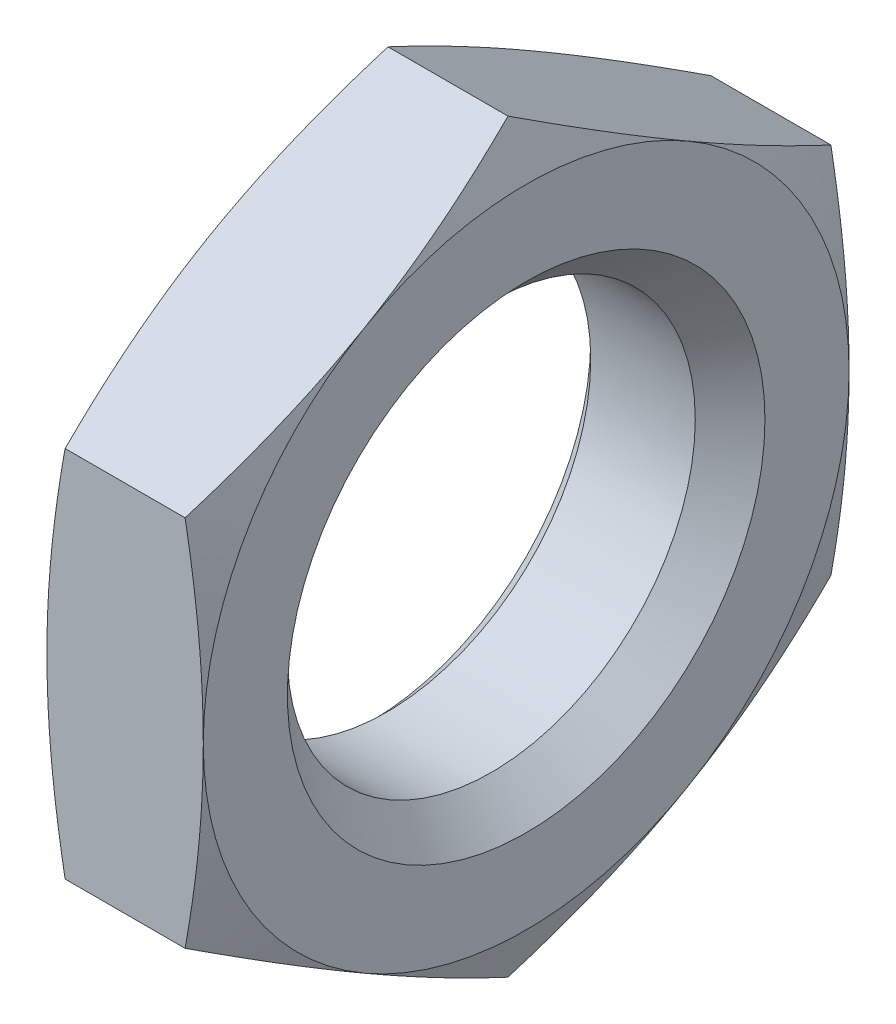
ISO-10303-21;
HEADER;
FILE_DESCRIPTION(('STEP AP214'),'2;1');
FILE_NAME('part.step','',(''),(''),'','','');
FILE_SCHEMA(('AUTOMOTIVE_DESIGN { 1 0 10303 214 1 1 1 1 }'));
ENDSEC;
DATA;
#1=APPLICATION_CONTEXT('core data for automotive mechanical design processes');
#2=APPLICATION_PROTOCOL_DEFINITION('international standard','automotive_design',2000,#1);
#3=PRODUCT_CONTEXT('',#1,'mechanical');
#4=PRODUCT('Part','Part','',(#3));
#5=PRODUCT_RELATED_PRODUCT_CATEGORY('part','',(#4));
#6=PRODUCT_DEFINITION_FORMATION('','',#4);
#7=PRODUCT_DEFINITION_CONTEXT('part definition',#1,'design');
#8=PRODUCT_DEFINITION('design','',#6,#7);
#9=PRODUCT_DEFINITION_SHAPE('','',#8);
#10=(LENGTH_UNIT() NAMED_UNIT(*) SI_UNIT(.MILLI.,.METRE.));
#11=(NAMED_UNIT(*) PLANE_ANGLE_UNIT() SI_UNIT($,.RADIAN.));
#12=(NAMED_UNIT(*) SI_UNIT($,.STERADIAN.) SOLID_ANGLE_UNIT());
#13=UNCERTAINTY_MEASURE_WITH_UNIT(LENGTH_MEASURE(1.E-05),#10,'distance_accuracy_value','');
#14=(GEOMETRIC_REPRESENTATION_CONTEXT(3) GLOBAL_UNCERTAINTY_ASSIGNED_CONTEXT((#13)) GLOBAL_UNIT_ASSIGNED_CONTEXT((#10,
#11,#12)) REPRESENTATION_CONTEXT('',''));
#15=CARTESIAN_POINT('',(0.,0.,0.));
#16=DIRECTION('',(0.,0.,1.));
#17=DIRECTION('',(1.,0.,0.));
#18=AXIS2_PLACEMENT_3D('',#15,#16,#17);
#19=CARTESIAN_POINT('',(4.6,-5.48482755730145,-9.5));
#20=DIRECTION('',(0.,0.,1.));
#21=DIRECTION('',(1.,0.,0.));
#22=AXIS2_PLACEMENT_3D('',#19,#20,#21);
#23=PLANE('',#22);
#24=CARTESIAN_POINT('',(1.69016042846238,-14.6906492705494,-9.5));
#25=CARTESIAN_POINT('',(1.82215849231707,-14.2586461701699,-9.5));
#26=CARTESIAN_POINT('',(1.9526519854738,-13.826174986575,-9.5));
#27=CARTESIAN_POINT('',(2.20979690079581,-12.9600574022299,-9.5));
#28=CARTESIAN_POINT('',(2.33644802973775,-12.5264109145254,-9.5));
#29=CARTESIAN_POINT('',(2.58526998313022,-11.6570179905832,-9.5));
#30=CARTESIAN_POINT('',(2.70743267745169,-11.2212692192771,-9.5));
#31=CARTESIAN_POINT('',(2.94589403263266,-10.3481722675464,-9.5));
#32=CARTESIAN_POINT('',(3.06219279541023,-9.91082411506174,-9.5));
#33=CARTESIAN_POINT('',(3.28593953803447,-9.04019078889748,-9.5));
#34=CARTESIAN_POINT('',(3.39348628323005,-8.60693112039079,-9.5));
#35=CARTESIAN_POINT('',(3.59967619625792,-7.73827648384001,-9.5));
#36=CARTESIAN_POINT('',(3.69831921737675,-7.30288148073498,-9.5));
#37=CARTESIAN_POINT('',(3.88446295534798,-6.42981246915943,-9.5));
#38=CARTESIAN_POINT('',(3.97196651224988,-5.99213907131408,-9.5));
#39=CARTESIAN_POINT('',(4.13321335889388,-5.11424564781017,-9.5));
#40=CARTESIAN_POINT('',(4.20695708392853,-4.67402570316605,-9.5));
#41=CARTESIAN_POINT('',(4.33047492386645,-3.84012107641747,-9.5));
#42=CARTESIAN_POINT('',(4.38200158695546,-3.44669842370897,-9.5));
#43=CARTESIAN_POINT('',(4.46979561028063,-2.65813983833987,-9.5));
#44=CARTESIAN_POINT('',(4.50606341372662,-2.26300395577871,-9.5));
#45=CARTESIAN_POINT('',(4.56159633544242,-1.47184236137885,-9.5));
#46=CARTESIAN_POINT('',(4.58087524296491,-1.07581763324345,-9.5));
#47=CARTESIAN_POINT('',(4.60145463348488,-0.283296424584435,-9.5));
#48=CARTESIAN_POINT('',(4.60275527182615,0.113200051833373,-9.5));
#49=CARTESIAN_POINT('',(4.58725804418716,0.908274529786345,-9.5));
#50=CARTESIAN_POINT('',(4.5703487448361,1.30685032411083,-9.5));
#51=CARTESIAN_POINT('',(4.51917564257239,2.10287716494433,-9.5));
#52=CARTESIAN_POINT('',(4.48491139098816,2.50032818210771,-9.5));
#53=CARTESIAN_POINT('',(4.40066616162399,3.29391681629852,-9.5));
#54=CARTESIAN_POINT('',(4.35067034998249,3.69005283562568,-9.5));
#55=CARTESIAN_POINT('',(4.23704287122736,4.48033399550387,-9.5));
#56=CARTESIAN_POINT('',(4.17341133614277,4.87447915529375,-9.5));
#57=CARTESIAN_POINT('',(4.01633773681218,5.7644530723873,-9.5));
#58=CARTESIAN_POINT('',(3.9194600029587,6.25967154005413,-9.5));
#59=CARTESIAN_POINT('',(3.7112330984246,7.2470800638562,-9.5));
#60=CARTESIAN_POINT('',(3.59988204471975,7.73926971719121,-9.5));
#61=CARTESIAN_POINT('',(3.36586942568909,8.721184851562,-9.5));
#62=CARTESIAN_POINT('',(3.24320240206139,9.21090902198873,-9.5));
#63=CARTESIAN_POINT('',(2.98912021266546,10.1880455315265,-9.5));
#64=CARTESIAN_POINT('',(2.85770542967618,10.6754579707943,-9.5));
#65=CARTESIAN_POINT('',(2.58777358427673,11.6493329745115,-9.5));
#66=CARTESIAN_POINT('',(2.44924310624163,12.1357918047624,-9.5));
#67=CARTESIAN_POINT('',(2.16677428119844,13.1071358887146,-9.5));
#68=CARTESIAN_POINT('',(2.0228358921785,13.5920211301595,-9.5));
#69=CARTESIAN_POINT('',(1.73069736534152,14.5603555263192,-9.5));
#70=CARTESIAN_POINT('',(1.58249842709697,15.0438050437813,-9.5));
#71=CARTESIAN_POINT('',(1.28264171899988,16.0096264649836,-9.5));
#72=CARTESIAN_POINT('',(1.13098396127824,16.4919983724968,-9.5));
#73=CARTESIAN_POINT('',(0.827354624808066,17.4479819321242,-9.5));
#74=CARTESIAN_POINT('',(0.67542857037621,17.921608062423,-9.5));
#75=CARTESIAN_POINT('',(0.369329943864128,18.8681343114334,-9.5));
#76=CARTESIAN_POINT('',(0.215157366101328,19.3410344283052,-9.5));
#77=CARTESIAN_POINT('',(-0.250168090468468,20.7588933126725,-9.5));
#78=CARTESIAN_POINT('',(-0.564105515033628,21.702938073155,-9.5));
#79=CARTESIAN_POINT('',(-1.19564554852189,23.5845436313424,-9.5));
#80=CARTESIAN_POINT('',(-1.51322197343011,24.5221132435445,-9.5));
#81=CARTESIAN_POINT('',(-1.99244452455637,25.9274354369996,-9.5));
#82=CARTESIAN_POINT('',(-2.15265300510778,26.3956789880379,-9.5));
#83=CARTESIAN_POINT('',(-2.47390652357468,27.3318781021275,-9.5));
#84=CARTESIAN_POINT('',(-2.63495155994444,27.7998336657092,-9.5));
#85=CARTESIAN_POINT('',(-2.7963543712881,28.2676657160387,-9.5));
#86=B_SPLINE_CURVE_WITH_KNOTS('',3,(#24,#25,#26,#27,#28,#29,#30,#31,#32,#33,#34,#35,#36,#37,#38,
#39,#40,#41,#42,#43,#44,#45,#46,#47,#48,#49,#50,#51,#52,#53,#54,#55,#56,#57,#58,#59,#60,#61,#62,
#63,#64,#65,#66,#67,#68,#69,#70,#71,#72,#73,#74,#75,#76,#77,#78,#79,#80,#81,#82,#83,#84,#85),
.UNSPECIFIED.,.F.,.F.,(4,2,2,2,2,2,2,2,2,2,2,2,2,2,2,2,2,2,2,2,2,2,2,2,2,2,2,2,2,2,4),(0.,
1.35516661270144,2.71043638376734,4.06805081235328,5.42564163678115,6.76479181829119,
8.10396406197691,9.44279419180246,10.7815819605266,11.9716729776471,13.1617294249212,
14.3508190557458,15.5398984120656,16.7362957512019,17.9327240219627,19.1302838464966,
20.3278320760804,21.8413576102316,23.3550802562645,24.8695369086461,26.3839273358942,
27.9012859684473,29.4186563911781,30.9356036981112,32.4525456855625,33.9447283366785,
35.4369147629214,38.4215160686589,41.3911901322074,42.8758675552437,44.3605422359361),.UNSPECIFIED.);
#87=CARTESIAN_POINT('',(4.06508928364747,-5.48482755730145,-9.5));
#88=VERTEX_POINT('',#87);
#89=CARTESIAN_POINT('',(4.6,0.,-9.5));
#90=VERTEX_POINT('',#89);
#91=EDGE_CURVE('E360',#88,#90,#86,.T.);
#92=ORIENTED_EDGE('',*,*,#91,.F.);
#93=DIRECTION('',(-1.,0.,0.));
#94=VECTOR('',#93,1.);
#95=CARTESIAN_POINT('',(4.6,-5.48482755730145,-9.5));
#96=LINE('',#95,#94);
#97=CARTESIAN_POINT('',(0.534910716352532,-5.48482755730145,-9.5));
#98=VERTEX_POINT('',#97);
#99=EDGE_CURVE('E259',#88,#98,#96,.T.);
#100=ORIENTED_EDGE('',*,*,#99,.T.);
#101=CARTESIAN_POINT('',(2.90983957153762,-14.6906492705494,-9.5));
#102=CARTESIAN_POINT('',(2.77784150768293,-14.2586461701699,-9.5));
#103=CARTESIAN_POINT('',(2.6473480145262,-13.826174986575,-9.5));
#104=CARTESIAN_POINT('',(2.39020309920419,-12.9600574022299,-9.5));
#105=CARTESIAN_POINT('',(2.26355197026226,-12.5264109145254,-9.5));
#106=CARTESIAN_POINT('',(2.01473001686978,-11.6570179905832,-9.5));
#107=CARTESIAN_POINT('',(1.89256732254831,-11.2212692192771,-9.5));
#108=CARTESIAN_POINT('',(1.65410596736734,-10.3481722675464,-9.5));
#109=CARTESIAN_POINT('',(1.53780720458977,-9.91082411506174,-9.5));
#110=CARTESIAN_POINT('',(1.31406046196553,-9.04019078889748,-9.5));
#111=CARTESIAN_POINT('',(1.20651371676995,-8.60693112039079,-9.5));
#112=CARTESIAN_POINT('',(1.00032380374208,-7.73827648384001,-9.5));
#113=CARTESIAN_POINT('',(0.901680782623253,-7.30288148073497,-9.5));
#114=CARTESIAN_POINT('',(0.715537044652023,-6.42981246915943,-9.5));
#115=CARTESIAN_POINT('',(0.628033487750122,-5.99213907131408,-9.5));
#116=CARTESIAN_POINT('',(0.466786641106125,-5.11424564781017,-9.5));
#117=CARTESIAN_POINT('',(0.393042916071473,-4.67402570316605,-9.5));
#118=CARTESIAN_POINT('',(0.269525076133549,-3.84012107641747,-9.5));
#119=CARTESIAN_POINT('',(0.217998413044543,-3.44669842370897,-9.5));
#120=CARTESIAN_POINT('',(0.130204389719366,-2.65813983833987,-9.5));
#121=CARTESIAN_POINT('',(0.0939365862733846,-2.26300395577871,-9.5));
#122=CARTESIAN_POINT('',(0.038403664557579,-1.47184236137885,-9.5));
#123=CARTESIAN_POINT('',(0.019124757035089,-1.07581763324345,-9.5));
#124=CARTESIAN_POINT('',(-0.00145463348487576,-0.283296424584434,-9.5));
#125=CARTESIAN_POINT('',(-0.00275527182614748,0.113200051833374,-9.5));
#126=CARTESIAN_POINT('',(0.0127419558128445,0.908274529786345,-9.5));
#127=CARTESIAN_POINT('',(0.0296512551638988,1.30685032411083,-9.5));
#128=CARTESIAN_POINT('',(0.0808243574276118,2.10287716494433,-9.5));
#129=CARTESIAN_POINT('',(0.115088609011836,2.50032818210771,-9.5));
#130=CARTESIAN_POINT('',(0.199333838376009,3.29391681629852,-9.5));
#131=CARTESIAN_POINT('',(0.249329650017512,3.69005283562567,-9.5));
#132=CARTESIAN_POINT('',(0.362957128772643,4.48033399550387,-9.5));
#133=CARTESIAN_POINT('',(0.426588663857229,4.87447915529375,-9.5));
#134=CARTESIAN_POINT('',(0.58366226318782,5.7644530723873,-9.5));
#135=CARTESIAN_POINT('',(0.680539997041296,6.25967154005413,-9.5));
#136=CARTESIAN_POINT('',(0.888766901575401,7.2470800638562,-9.5));
#137=CARTESIAN_POINT('',(1.00011795528025,7.73926971719121,-9.5));
#138=CARTESIAN_POINT('',(1.23413057431091,8.72118485156201,-9.5));
#139=CARTESIAN_POINT('',(1.35679759793861,9.21090902198873,-9.5));
#140=CARTESIAN_POINT('',(1.61087978733454,10.1880455315265,-9.5));
#141=CARTESIAN_POINT('',(1.74229457032382,10.6754579707943,-9.5));
#142=CARTESIAN_POINT('',(2.01222641572327,11.6493329745115,-9.5));
#143=CARTESIAN_POINT('',(2.15075689375836,12.1357918047624,-9.5));
#144=CARTESIAN_POINT('',(2.43322571880155,13.1071358887146,-9.5));
#145=CARTESIAN_POINT('',(2.5771641078215,13.5920211301595,-9.5));
#146=CARTESIAN_POINT('',(2.86930263465848,14.5603555263192,-9.5));
#147=CARTESIAN_POINT('',(3.01750157290303,15.0438050437813,-9.5));
#148=CARTESIAN_POINT('',(3.31735828100012,16.0096264649836,-9.5));
#149=CARTESIAN_POINT('',(3.46901603872176,16.4919983724968,-9.5));
#150=CARTESIAN_POINT('',(3.77264537519193,17.4479819321242,-9.5));
#151=CARTESIAN_POINT('',(3.92457142962379,17.921608062423,-9.5));
#152=CARTESIAN_POINT('',(4.23067005613587,18.8681343114334,-9.5));
#153=CARTESIAN_POINT('',(4.38484263389867,19.3410344283052,-9.5));
#154=CARTESIAN_POINT('',(4.85016809046847,20.7588933126725,-9.5));
#155=CARTESIAN_POINT('',(5.16410551503363,21.702938073155,-9.5));
#156=CARTESIAN_POINT('',(5.79564554852189,23.5845436313424,-9.5));
#157=CARTESIAN_POINT('',(6.11322197343011,24.5221132435445,-9.5));
#158=CARTESIAN_POINT('',(6.59244452455637,25.9274354369996,-9.5));
#159=CARTESIAN_POINT('',(6.75265300510777,26.3956789880379,-9.5));
#160=CARTESIAN_POINT('',(7.07390652357468,27.3318781021275,-9.5));
#161=CARTESIAN_POINT('',(7.23495155994444,27.7998336657092,-9.5));
#162=CARTESIAN_POINT('',(7.3963543712881,28.2676657160387,-9.5));
#163=B_SPLINE_CURVE_WITH_KNOTS('',3,(#101,#102,#103,#104,#105,#106,#107,#108,#109,#110,#111,
#112,#113,#114,#115,#116,#117,#118,#119,#120,#121,#122,#123,#124,#125,#126,#127,#128,#129,#130,
#131,#132,#133,#134,#135,#136,#137,#138,#139,#140,#141,#142,#143,#144,#145,#146,#147,#148,#149,
#150,#151,#152,#153,#154,#155,#156,#157,#158,#159,#160,#161,#162),.UNSPECIFIED.,.F.,.F.,(4,2,2,
2,2,2,2,2,2,2,2,2,2,2,2,2,2,2,2,2,2,2,2,2,2,2,2,2,2,2,4),(0.,1.35516661270144,2.71043638376734,
4.06805081235328,5.42564163678115,6.76479181829119,8.10396406197691,9.44279419180246,
10.7815819605266,11.9716729776471,13.1617294249212,14.3508190557458,15.5398984120656,
16.7362957512019,17.9327240219628,19.1302838464966,20.3278320760804,21.8413576102316,
23.3550802562645,24.8695369086461,26.3839273358942,27.9012859684473,29.4186563911781,
30.9356036981112,32.4525456855625,33.9447283366785,35.4369147629214,38.4215160686589,
41.3911901322074,42.8758675552437,44.3605422359361),.UNSPECIFIED.);
#164=CARTESIAN_POINT('',(0.,0.,-9.5));
#165=VERTEX_POINT('',#164);
#166=EDGE_CURVE('E232',#165,#98,#163,.F.);
#167=ORIENTED_EDGE('',*,*,#166,.F.);
#168=CARTESIAN_POINT('',(0.534910716352532,5.48482755730144,-9.5));
#169=VERTEX_POINT('',#168);
#170=EDGE_CURVE('E313',#169,#165,#163,.F.);
#171=ORIENTED_EDGE('',*,*,#170,.F.);
#172=DIRECTION('',(-1.,0.,0.));
#173=VECTOR('',#172,1.);
#174=CARTESIAN_POINT('',(4.6,5.48482755730144,-9.5));
#175=LINE('',#174,#173);
#176=CARTESIAN_POINT('',(4.06508928364747,5.48482755730144,-9.5));
#177=VERTEX_POINT('',#176);
#178=EDGE_CURVE('E268',#177,#169,#175,.T.);
#179=ORIENTED_EDGE('',*,*,#178,.F.);
#180=EDGE_CURVE('E135',#90,#177,#86,.T.);
#181=ORIENTED_EDGE('',*,*,#180,.F.);
#182=EDGE_LOOP('',(#92,#100,#167,#171,#179,#181));
#183=FACE_BOUND('',#182,.T.);
#184=ADVANCED_FACE('F41',(#183),#23,.F.);
#185=CARTESIAN_POINT('',(4.6,5.48482755730144,-9.5));
#186=DIRECTION('',(0.,-0.866025403784439,0.5));
#187=DIRECTION('',(0.,-0.5,-0.866025403784439));
#188=AXIS2_PLACEMENT_3D('',#185,#186,#187);
#189=PLANE('',#188);
#190=CARTESIAN_POINT('',(4.06504725532133,5.48471208724761,-9.5002));
#191=CARTESIAN_POINT('',(4.14775226515756,5.71186037906177,-9.10676761772539));
#192=CARTESIAN_POINT('',(4.22298670062744,5.93975769408489,-8.71203788919681));
#193=CARTESIAN_POINT('',(4.35534994593938,6.39703409451001,-7.9200119305583));
#194=CARTESIAN_POINT('',(4.41246458882594,6.62641419696568,-7.52271393885971));
#195=CARTESIAN_POINT('',(4.50484585008277,7.08411065313119,-6.72996042233683));
#196=CARTESIAN_POINT('',(4.54031396059948,7.31241655475264,-6.33452300106066));
#197=CARTESIAN_POINT('',(4.58788665549306,7.76956223785021,-5.54272345147488));
#198=CARTESIAN_POINT('',(4.6,7.99840178690119,-5.14636172573744));
#199=CARTESIAN_POINT('',(4.6,8.45608088500314,-4.35363827426256));
#200=CARTESIAN_POINT('',(4.58788665549306,8.68492043405412,-3.95727654852512));
#201=CARTESIAN_POINT('',(4.54031396059948,9.14206611715169,-3.16547699893935));
#202=CARTESIAN_POINT('',(4.50484585008277,9.37037201877314,-2.77003957766318));
#203=CARTESIAN_POINT('',(4.41246458882594,9.82806847493865,-1.97728606114029));
#204=CARTESIAN_POINT('',(4.35534994593938,10.0574485773943,-1.57998806944171));
#205=CARTESIAN_POINT('',(4.22298670062745,10.5147249778194,-0.787962110803195));
#206=CARTESIAN_POINT('',(4.14775226515756,10.7426222928426,-0.393232382274612));
#207=CARTESIAN_POINT('',(4.06504725532133,10.9697705846567,0.000199999999994437));
#208=B_SPLINE_CURVE_WITH_KNOTS('',3,(#190,#191,#192,#193,#194,#195,#196,#197,#198,#199,#200,
#201,#202,#203,#204,#205,#206,#207),.UNSPECIFIED.,.F.,.F.,(4,2,2,2,2,2,2,2,4),(0.,
1.38543330348909,2.7719471533321,4.14534984875091,5.51823729479097,6.89112474083103,
8.26452743624984,9.65104128609285,11.0364745895819),.UNSPECIFIED.);
#209=CARTESIAN_POINT('',(4.6,8.22724133595217,-4.75));
#210=VERTEX_POINT('',#209);
#211=EDGE_CURVE('E131',#177,#210,#208,.T.);
#212=ORIENTED_EDGE('',*,*,#211,.F.);
#213=ORIENTED_EDGE('',*,*,#178,.T.);
#214=CARTESIAN_POINT('',(0.534952744678665,10.9697705846567,0.000199999999997419));
#215=CARTESIAN_POINT('',(0.452247734842436,10.7426222928426,-0.393232382274609));
#216=CARTESIAN_POINT('',(0.377013299372555,10.5147249778194,-0.787962110803192));
#217=CARTESIAN_POINT('',(0.244650054060625,10.0574485773943,-1.5799880694417));
#218=CARTESIAN_POINT('',(0.187535411174057,9.82806847493865,-1.97728606114029));
#219=CARTESIAN_POINT('',(0.0951541499172327,9.37037201877314,-2.77003957766317));
#220=CARTESIAN_POINT('',(0.0596860394005187,9.14206611715169,-3.16547699893935));
#221=CARTESIAN_POINT('',(0.0121133445069416,8.68492043405412,-3.95727654852512));
#222=CARTESIAN_POINT('',(0.,8.45608088500314,-4.35363827426256));
#223=CARTESIAN_POINT('',(0.,7.99840178690119,-5.14636172573744));
#224=CARTESIAN_POINT('',(0.012113344506941,7.76956223785022,-5.54272345147488));
#225=CARTESIAN_POINT('',(0.0596860394005181,7.31241655475264,-6.33452300106066));
#226=CARTESIAN_POINT('',(0.0951541499172324,7.08411065313119,-6.72996042233683));
#227=CARTESIAN_POINT('',(0.187535411174057,6.62641419696568,-7.52271393885971));
#228=CARTESIAN_POINT('',(0.244650054060625,6.39703409451001,-7.9200119305583));
#229=CARTESIAN_POINT('',(0.377013299372555,5.93975769408489,-8.71203788919681));
#230=CARTESIAN_POINT('',(0.452247734842436,5.71186037906177,-9.1067676177254));
#231=CARTESIAN_POINT('',(0.534952744678666,5.48471208724761,-9.5002));
#232=B_SPLINE_CURVE_WITH_KNOTS('',3,(#214,#215,#216,#217,#218,#219,#220,#221,#222,#223,#224,
#225,#226,#227,#228,#229,#230,#231),.UNSPECIFIED.,.F.,.F.,(4,2,2,2,2,2,2,2,4),(0.,
1.38543330348909,2.7719471533321,4.14534984875091,5.51823729479097,6.89112474083104,
8.26452743624984,9.65104128609286,11.0364745895819),.UNSPECIFIED.);
#233=CARTESIAN_POINT('',(0.,8.22724133595217,-4.75));
#234=VERTEX_POINT('',#233);
#235=EDGE_CURVE('E229',#234,#169,#232,.T.);
#236=ORIENTED_EDGE('',*,*,#235,.F.);
#237=CARTESIAN_POINT('',(0.534910716352532,10.9696551146029,0.));
#238=VERTEX_POINT('',#237);
#239=EDGE_CURVE('E244',#238,#234,#232,.T.);
#240=ORIENTED_EDGE('',*,*,#239,.F.);
#241=DIRECTION('',(-1.,0.,0.));
#242=VECTOR('',#241,1.);
#243=CARTESIAN_POINT('',(4.6,10.9696551146029,0.));
#244=LINE('',#243,#242);
#245=CARTESIAN_POINT('',(4.06508928364747,10.9696551146029,0.));
#246=VERTEX_POINT('',#245);
#247=EDGE_CURVE('E154',#246,#238,#244,.T.);
#248=ORIENTED_EDGE('',*,*,#247,.F.);
#249=EDGE_CURVE('E139',#210,#246,#208,.T.);
#250=ORIENTED_EDGE('',*,*,#249,.F.);
#251=EDGE_LOOP('',(#212,#213,#236,#240,#248,#250));
#252=FACE_BOUND('',#251,.T.);
#253=ADVANCED_FACE('F152',(#252),#189,.F.);
#254=CARTESIAN_POINT('',(4.6,10.9696551146029,0.));
#255=DIRECTION('',(0.,-0.866025403784438,-0.5));
#256=DIRECTION('',(0.,0.5,-0.866025403784438));
#257=AXIS2_PLACEMENT_3D('',#254,#255,#256);
#258=PLANE('',#257);
#259=CARTESIAN_POINT('',(4.06504725532133,10.9697705846567,-0.000200000000002165));
#260=CARTESIAN_POINT('',(4.14775226515756,10.7426222928426,0.393232382274604));
#261=CARTESIAN_POINT('',(4.22298670062744,10.5147249778194,0.787962110803187));
#262=CARTESIAN_POINT('',(4.35534994593938,10.0574485773943,1.5799880694417));
#263=CARTESIAN_POINT('',(4.41246458882594,9.82806847493865,1.97728606114028));
#264=CARTESIAN_POINT('',(4.50484585008277,9.37037201877314,2.77003957766317));
#265=CARTESIAN_POINT('',(4.54031396059948,9.14206611715169,3.16547699893934));
#266=CARTESIAN_POINT('',(4.58788665549306,8.68492043405412,3.95727654852512));
#267=CARTESIAN_POINT('',(4.6,8.45608088500314,4.35363827426256));
#268=CARTESIAN_POINT('',(4.6,7.99840178690119,5.14636172573744));
#269=CARTESIAN_POINT('',(4.58788665549306,7.76956223785021,5.54272345147488));
#270=CARTESIAN_POINT('',(4.54031396059948,7.31241655475264,6.33452300106065));
#271=CARTESIAN_POINT('',(4.50484585008277,7.08411065313119,6.72996042233683));
#272=CARTESIAN_POINT('',(4.41246458882595,6.62641419696568,7.52271393885971));
#273=CARTESIAN_POINT('',(4.35534994593938,6.39703409451001,7.92001193055829));
#274=CARTESIAN_POINT('',(4.22298670062745,5.93975769408489,8.71203788919681));
#275=CARTESIAN_POINT('',(4.14775226515757,5.71186037906176,9.10676761772539));
#276=CARTESIAN_POINT('',(4.06504725532134,5.4847120872476,9.5002));
#277=B_SPLINE_CURVE_WITH_KNOTS('',3,(#259,#260,#261,#262,#263,#264,#265,#266,#267,#268,#269,
#270,#271,#272,#273,#274,#275,#276),.UNSPECIFIED.,.F.,.F.,(4,2,2,2,2,2,2,2,4),(0.,
1.38543330348909,2.7719471533321,4.14534984875091,5.51823729479098,6.89112474083104,
8.26452743624985,9.65104128609286,11.036474589582),.UNSPECIFIED.);
#278=CARTESIAN_POINT('',(4.6,8.22724133595216,4.75));
#279=VERTEX_POINT('',#278);
#280=EDGE_CURVE('E144',#246,#279,#277,.T.);
#281=ORIENTED_EDGE('',*,*,#280,.F.);
#282=ORIENTED_EDGE('',*,*,#247,.T.);
#283=CARTESIAN_POINT('',(0.534952744678664,5.4847120872476,9.5002));
#284=CARTESIAN_POINT('',(0.452247734842435,5.71186037906176,9.10676761772539));
#285=CARTESIAN_POINT('',(0.377013299372554,5.93975769408489,8.71203788919681));
#286=CARTESIAN_POINT('',(0.244650054060624,6.39703409451,7.9200119305583));
#287=CARTESIAN_POINT('',(0.187535411174056,6.62641419696568,7.52271393885971));
#288=CARTESIAN_POINT('',(0.0951541499172317,7.08411065313119,6.72996042233683));
#289=CARTESIAN_POINT('',(0.0596860394005171,7.31241655475264,6.33452300106065));
#290=CARTESIAN_POINT('',(0.0121133445069398,7.76956223785021,5.54272345147488));
#291=CARTESIAN_POINT('',(0.,7.99840178690119,5.14636172573744));
#292=CARTESIAN_POINT('',(0.,8.45608088500314,4.35363827426256));
#293=CARTESIAN_POINT('',(0.0121133445069403,8.68492043405412,3.95727654852512));
#294=CARTESIAN_POINT('',(0.0596860394005175,9.14206611715169,3.16547699893934));
#295=CARTESIAN_POINT('',(0.0951541499172318,9.37037201877314,2.77003957766317));
#296=CARTESIAN_POINT('',(0.187535411174056,9.82806847493865,1.97728606114029));
#297=CARTESIAN_POINT('',(0.244650054060625,10.0574485773943,1.5799880694417));
#298=CARTESIAN_POINT('',(0.377013299372555,10.5147249778194,0.787962110803188));
#299=CARTESIAN_POINT('',(0.452247734842436,10.7426222928426,0.393232382274605));
#300=CARTESIAN_POINT('',(0.534952744678666,10.9697705846567,-0.000200000000001519));
#301=B_SPLINE_CURVE_WITH_KNOTS('',3,(#283,#284,#285,#286,#287,#288,#289,#290,#291,#292,#293,
#294,#295,#296,#297,#298,#299,#300),.UNSPECIFIED.,.F.,.F.,(4,2,2,2,2,2,2,2,4),(0.,
1.38543330348909,2.7719471533321,4.14534984875091,5.51823729479097,6.89112474083104,
8.26452743624984,9.65104128609286,11.0364745895819),.UNSPECIFIED.);
#302=CARTESIAN_POINT('',(0.,8.22724133595216,4.75));
#303=VERTEX_POINT('',#302);
#304=EDGE_CURVE('E245',#303,#238,#301,.T.);
#305=ORIENTED_EDGE('',*,*,#304,.F.);
#306=CARTESIAN_POINT('',(0.534910716352531,5.48482755730144,9.5));
#307=VERTEX_POINT('',#306);
#308=EDGE_CURVE('E252',#307,#303,#301,.T.);
#309=ORIENTED_EDGE('',*,*,#308,.F.);
#310=DIRECTION('',(-1.,0.,0.));
#311=VECTOR('',#310,1.);
#312=CARTESIAN_POINT('',(4.6,5.48482755730144,9.5));
#313=LINE('',#312,#311);
#314=CARTESIAN_POINT('',(4.06508928364747,5.48482755730144,9.5));
#315=VERTEX_POINT('',#314);
#316=EDGE_CURVE('E265',#315,#307,#313,.T.);
#317=ORIENTED_EDGE('',*,*,#316,.F.);
#318=EDGE_CURVE('E155',#279,#315,#277,.T.);
#319=ORIENTED_EDGE('',*,*,#318,.F.);
#320=EDGE_LOOP('',(#281,#282,#305,#309,#317,#319));
#321=FACE_BOUND('',#320,.T.);
#322=ADVANCED_FACE('F216',(#321),#258,.F.);
#323=CARTESIAN_POINT('',(4.6,5.48482755730144,9.5));
#324=DIRECTION('',(0.,0.,-1.));
#325=DIRECTION('',(-1.,0.,0.));
#326=AXIS2_PLACEMENT_3D('',#323,#324,#325);
#327=PLANE('',#326);
#328=CARTESIAN_POINT('',(1.69016042846238,-14.6906492705494,9.5));
#329=CARTESIAN_POINT('',(1.82215849231707,-14.2586461701699,9.5));
#330=CARTESIAN_POINT('',(1.9526519854738,-13.826174986575,9.5));
#331=CARTESIAN_POINT('',(2.20979690079581,-12.9600574022299,9.5));
#332=CARTESIAN_POINT('',(2.33644802973775,-12.5264109145254,9.5));
#333=CARTESIAN_POINT('',(2.58526998313022,-11.6570179905832,9.5));
#334=CARTESIAN_POINT('',(2.70743267745169,-11.2212692192771,9.5));
#335=CARTESIAN_POINT('',(2.94589403263266,-10.3481722675464,9.5));
#336=CARTESIAN_POINT('',(3.06219279541023,-9.91082411506175,9.5));
#337=CARTESIAN_POINT('',(3.28593953803447,-9.04019078889749,9.5));
#338=CARTESIAN_POINT('',(3.39348628323005,-8.60693112039079,9.5));
#339=CARTESIAN_POINT('',(3.59967619625792,-7.73827648384001,9.5));
#340=CARTESIAN_POINT('',(3.69831921737675,-7.30288148073498,9.5));
#341=CARTESIAN_POINT('',(3.88446295534798,-6.42981246915944,9.5));
#342=CARTESIAN_POINT('',(3.97196651224988,-5.99213907131409,9.5));
#343=CARTESIAN_POINT('',(4.13321335889388,-5.11424564781017,9.5));
#344=CARTESIAN_POINT('',(4.20695708392853,-4.67402570316606,9.5));
#345=CARTESIAN_POINT('',(4.33047492386645,-3.84012107641747,9.5));
#346=CARTESIAN_POINT('',(4.38200158695546,-3.44669842370897,9.5));
#347=CARTESIAN_POINT('',(4.46979561028063,-2.65813983833987,9.5));
#348=CARTESIAN_POINT('',(4.50606341372662,-2.26300395577871,9.5));
#349=CARTESIAN_POINT('',(4.56159633544242,-1.47184236137885,9.5));
#350=CARTESIAN_POINT('',(4.58087524296491,-1.07581763324345,9.5));
#351=CARTESIAN_POINT('',(4.60145463348488,-0.283296424584436,9.5));
#352=CARTESIAN_POINT('',(4.60275527182615,0.113200051833372,9.5));
#353=CARTESIAN_POINT('',(4.58725804418716,0.908274529786344,9.5));
#354=CARTESIAN_POINT('',(4.5703487448361,1.30685032411083,9.5));
#355=CARTESIAN_POINT('',(4.51917564257239,2.10287716494433,9.5));
#356=CARTESIAN_POINT('',(4.48491139098817,2.50032818210771,9.5));
#357=CARTESIAN_POINT('',(4.40066616162399,3.29391681629852,9.5));
#358=CARTESIAN_POINT('',(4.35067034998249,3.69005283562567,9.5));
#359=CARTESIAN_POINT('',(4.23704287122736,4.48033399550387,9.5));
#360=CARTESIAN_POINT('',(4.17341133614277,4.87447915529375,9.5));
#361=CARTESIAN_POINT('',(4.01633773681218,5.7644530723873,9.5));
#362=CARTESIAN_POINT('',(3.91946000295871,6.25967154005413,9.5));
#363=CARTESIAN_POINT('',(3.7112330984246,7.2470800638562,9.5));
#364=CARTESIAN_POINT('',(3.59988204471975,7.73926971719121,9.5));
#365=CARTESIAN_POINT('',(3.36586942568909,8.721184851562,9.5));
#366=CARTESIAN_POINT('',(3.24320240206139,9.21090902198873,9.5));
#367=CARTESIAN_POINT('',(2.98912021266546,10.1880455315265,9.5));
#368=CARTESIAN_POINT('',(2.85770542967618,10.6754579707943,9.5));
#369=CARTESIAN_POINT('',(2.58777358427673,11.6493329745115,9.5));
#370=CARTESIAN_POINT('',(2.44924310624164,12.1357918047624,9.5));
#371=CARTESIAN_POINT('',(2.16677428119845,13.1071358887146,9.5));
#372=CARTESIAN_POINT('',(2.0228358921785,13.5920211301594,9.5));
#373=CARTESIAN_POINT('',(1.73069736534152,14.5603555263192,9.5));
#374=CARTESIAN_POINT('',(1.58249842709697,15.0438050437813,9.5));
#375=CARTESIAN_POINT('',(1.28264171899988,16.0096264649836,9.5));
#376=CARTESIAN_POINT('',(1.13098396127825,16.4919983724968,9.5));
#377=CARTESIAN_POINT('',(0.82735462480807,17.4479819321242,9.5));
#378=CARTESIAN_POINT('',(0.675428570376214,17.921608062423,9.5));
#379=CARTESIAN_POINT('',(0.369329943864131,18.8681343114334,9.5));
#380=CARTESIAN_POINT('',(0.215157366101331,19.3410344283052,9.5));
#381=CARTESIAN_POINT('',(-0.250168090468465,20.7588933126725,9.5));
#382=CARTESIAN_POINT('',(-0.564105515033627,21.702938073155,9.5));
#383=CARTESIAN_POINT('',(-1.19564554852188,23.5845436313424,9.5));
#384=CARTESIAN_POINT('',(-1.51322197343011,24.5221132435445,9.5));
#385=CARTESIAN_POINT('',(-1.99244452455637,25.9274354369996,9.5));
#386=CARTESIAN_POINT('',(-2.15265300510777,26.3956789880379,9.5));
#387=CARTESIAN_POINT('',(-2.47390652357468,27.3318781021275,9.5));
#388=CARTESIAN_POINT('',(-2.63495155994444,27.7998336657092,9.5));
#389=CARTESIAN_POINT('',(-2.7963543712881,28.2676657160387,9.5));
#390=B_SPLINE_CURVE_WITH_KNOTS('',3,(#328,#329,#330,#331,#332,#333,#334,#335,#336,#337,#338,
#339,#340,#341,#342,#343,#344,#345,#346,#347,#348,#349,#350,#351,#352,#353,#354,#355,#356,#357,
#358,#359,#360,#361,#362,#363,#364,#365,#366,#367,#368,#369,#370,#371,#372,#373,#374,#375,#376,
#377,#378,#379,#380,#381,#382,#383,#384,#385,#386,#387,#388,#389),.UNSPECIFIED.,.F.,.F.,(4,2,2,
2,2,2,2,2,2,2,2,2,2,2,2,2,2,2,2,2,2,2,2,2,2,2,2,2,2,2,4),(0.,1.35516661270144,2.71043638376733,
4.06805081235327,5.42564163678115,6.76479181829118,8.10396406197691,9.44279419180245,
10.7815819605266,11.9716729776471,13.1617294249211,14.3508190557458,15.5398984120656,
16.7362957512019,17.9327240219627,19.1302838464966,20.3278320760804,21.8413576102316,
23.3550802562645,24.8695369086461,26.3839273358942,27.9012859684473,29.4186563911781,
30.9356036981112,32.4525456855625,33.9447283366785,35.4369147629214,38.4215160686589,
41.3911901322074,42.8758675552437,44.3605422359361),.UNSPECIFIED.);
#391=CARTESIAN_POINT('',(4.6,0.,9.5));
#392=VERTEX_POINT('',#391);
#393=EDGE_CURVE('E210',#315,#392,#390,.F.);
#394=ORIENTED_EDGE('',*,*,#393,.F.);
#395=ORIENTED_EDGE('',*,*,#316,.T.);
#396=CARTESIAN_POINT('',(2.90983957153762,-14.6906492705494,9.5));
#397=CARTESIAN_POINT('',(2.77784150768293,-14.2586461701699,9.5));
#398=CARTESIAN_POINT('',(2.6473480145262,-13.826174986575,9.5));
#399=CARTESIAN_POINT('',(2.39020309920419,-12.9600574022299,9.5));
#400=CARTESIAN_POINT('',(2.26355197026226,-12.5264109145254,9.5));
#401=CARTESIAN_POINT('',(2.01473001686978,-11.6570179905832,9.5));
#402=CARTESIAN_POINT('',(1.89256732254831,-11.2212692192771,9.5));
#403=CARTESIAN_POINT('',(1.65410596736734,-10.3481722675464,9.5));
#404=CARTESIAN_POINT('',(1.53780720458977,-9.91082411506174,9.5));
#405=CARTESIAN_POINT('',(1.31406046196553,-9.04019078889749,9.5));
#406=CARTESIAN_POINT('',(1.20651371676995,-8.60693112039079,9.5));
#407=CARTESIAN_POINT('',(1.00032380374208,-7.73827648384001,9.5));
#408=CARTESIAN_POINT('',(0.901680782623253,-7.30288148073498,9.5));
#409=CARTESIAN_POINT('',(0.715537044652023,-6.42981246915944,9.5));
#410=CARTESIAN_POINT('',(0.628033487750122,-5.99213907131409,9.5));
#411=CARTESIAN_POINT('',(0.466786641106125,-5.11424564781017,9.5));
#412=CARTESIAN_POINT('',(0.393042916071472,-4.67402570316606,9.5));
#413=CARTESIAN_POINT('',(0.269525076133548,-3.84012107641747,9.5));
#414=CARTESIAN_POINT('',(0.217998413044543,-3.44669842370897,9.5));
#415=CARTESIAN_POINT('',(0.130204389719366,-2.65813983833987,9.5));
#416=CARTESIAN_POINT('',(0.0939365862733835,-2.26300395577871,9.5));
#417=CARTESIAN_POINT('',(0.0384036645575777,-1.47184236137885,9.5));
#418=CARTESIAN_POINT('',(0.0191247570350877,-1.07581763324345,9.5));
#419=CARTESIAN_POINT('',(-0.00145463348487699,-0.283296424584436,9.5));
#420=CARTESIAN_POINT('',(-0.00275527182614861,0.113200051833372,9.5));
#421=CARTESIAN_POINT('',(0.0127419558128431,0.908274529786344,9.5));
#422=CARTESIAN_POINT('',(0.029651255163897,1.30685032411083,9.5));
#423=CARTESIAN_POINT('',(0.0808243574276099,2.10287716494433,9.5));
#424=CARTESIAN_POINT('',(0.115088609011834,2.50032818210771,9.5));
#425=CARTESIAN_POINT('',(0.199333838376009,3.29391681629852,9.5));
#426=CARTESIAN_POINT('',(0.249329650017511,3.69005283562567,9.5));
#427=CARTESIAN_POINT('',(0.362957128772642,4.48033399550387,9.5));
#428=CARTESIAN_POINT('',(0.426588663857228,4.87447915529375,9.5));
#429=CARTESIAN_POINT('',(0.583662263187819,5.7644530723873,9.5));
#430=CARTESIAN_POINT('',(0.680539997041294,6.25967154005413,9.5));
#431=CARTESIAN_POINT('',(0.888766901575399,7.2470800638562,9.5));
#432=CARTESIAN_POINT('',(1.00011795528025,7.73926971719121,9.5));
#433=CARTESIAN_POINT('',(1.23413057431091,8.721184851562,9.5));
#434=CARTESIAN_POINT('',(1.35679759793861,9.21090902198872,9.5));
#435=CARTESIAN_POINT('',(1.61087978733454,10.1880455315265,9.5));
#436=CARTESIAN_POINT('',(1.74229457032382,10.6754579707943,9.5));
#437=CARTESIAN_POINT('',(2.01222641572327,11.6493329745115,9.5));
#438=CARTESIAN_POINT('',(2.15075689375836,12.1357918047624,9.5));
#439=CARTESIAN_POINT('',(2.43322571880155,13.1071358887146,9.5));
#440=CARTESIAN_POINT('',(2.5771641078215,13.5920211301594,9.5));
#441=CARTESIAN_POINT('',(2.86930263465848,14.5603555263192,9.5));
#442=CARTESIAN_POINT('',(3.01750157290303,15.0438050437813,9.5));
#443=CARTESIAN_POINT('',(3.31735828100012,16.0096264649836,9.5));
#444=CARTESIAN_POINT('',(3.46901603872176,16.4919983724968,9.5));
#445=CARTESIAN_POINT('',(3.77264537519193,17.4479819321242,9.5));
#446=CARTESIAN_POINT('',(3.92457142962378,17.921608062423,9.5));
#447=CARTESIAN_POINT('',(4.23067005613587,18.8681343114334,9.5));
#448=CARTESIAN_POINT('',(4.38484263389867,19.3410344283051,9.5));
#449=CARTESIAN_POINT('',(4.85016809046847,20.7588933126725,9.5));
#450=CARTESIAN_POINT('',(5.16410551503363,21.702938073155,9.5));
#451=CARTESIAN_POINT('',(5.79564554852188,23.5845436313424,9.5));
#452=CARTESIAN_POINT('',(6.11322197343011,24.5221132435445,9.5));
#453=CARTESIAN_POINT('',(6.59244452455637,25.9274354369996,9.5));
#454=CARTESIAN_POINT('',(6.75265300510777,26.3956789880379,9.5));
#455=CARTESIAN_POINT('',(7.07390652357468,27.3318781021275,9.5));
#456=CARTESIAN_POINT('',(7.23495155994444,27.7998336657092,9.5));
#457=CARTESIAN_POINT('',(7.3963543712881,28.2676657160387,9.5));
#458=B_SPLINE_CURVE_WITH_KNOTS('',3,(#396,#397,#398,#399,#400,#401,#402,#403,#404,#405,#406,
#407,#408,#409,#410,#411,#412,#413,#414,#415,#416,#417,#418,#419,#420,#421,#422,#423,#424,#425,
#426,#427,#428,#429,#430,#431,#432,#433,#434,#435,#436,#437,#438,#439,#440,#441,#442,#443,#444,
#445,#446,#447,#448,#449,#450,#451,#452,#453,#454,#455,#456,#457),.UNSPECIFIED.,.F.,.F.,(4,2,2,
2,2,2,2,2,2,2,2,2,2,2,2,2,2,2,2,2,2,2,2,2,2,2,2,2,2,2,4),(0.,1.35516661270144,2.71043638376733,
4.06805081235327,5.42564163678115,6.76479181829118,8.10396406197691,9.44279419180245,
10.7815819605266,11.9716729776471,13.1617294249212,14.3508190557458,15.5398984120656,
16.7362957512019,17.9327240219627,19.1302838464966,20.3278320760804,21.8413576102316,
23.3550802562645,24.8695369086461,26.3839273358942,27.9012859684473,29.4186563911781,
30.9356036981112,32.4525456855625,33.9447283366785,35.4369147629214,38.4215160686589,
41.3911901322074,42.8758675552437,44.3605422359361),.UNSPECIFIED.);
#459=CARTESIAN_POINT('',(0.,0.,9.5));
#460=VERTEX_POINT('',#459);
#461=EDGE_CURVE('E231',#460,#307,#458,.T.);
#462=ORIENTED_EDGE('',*,*,#461,.F.);
#463=CARTESIAN_POINT('',(0.534910716352531,-5.48482755730145,9.5));
#464=VERTEX_POINT('',#463);
#465=EDGE_CURVE('E222',#464,#460,#458,.T.);
#466=ORIENTED_EDGE('',*,*,#465,.F.);
#467=DIRECTION('',(-1.,0.,0.));
#468=VECTOR('',#467,1.);
#469=CARTESIAN_POINT('',(4.6,-5.48482755730145,9.5));
#470=LINE('',#469,#468);
#471=CARTESIAN_POINT('',(4.06508928364747,-5.48482755730145,9.5));
#472=VERTEX_POINT('',#471);
#473=EDGE_CURVE('E263',#472,#464,#470,.T.);
#474=ORIENTED_EDGE('',*,*,#473,.F.);
#475=EDGE_CURVE('E204',#392,#472,#390,.F.);
#476=ORIENTED_EDGE('',*,*,#475,.F.);
#477=EDGE_LOOP('',(#394,#395,#462,#466,#474,#476));
#478=FACE_BOUND('',#477,.T.);
#479=ADVANCED_FACE('F212',(#478),#327,.F.);
#480=CARTESIAN_POINT('',(4.6,-5.48482755730145,9.5));
#481=DIRECTION('',(0.,0.866025403784439,-0.5));
#482=DIRECTION('',(0.,0.5,0.866025403784439));
#483=AXIS2_PLACEMENT_3D('',#480,#481,#482);
#484=PLANE('',#483);
#485=CARTESIAN_POINT('',(4.06504725532133,-5.48471208724761,9.5002));
#486=CARTESIAN_POINT('',(4.14775226515756,-5.71186037906177,9.10676761772539));
#487=CARTESIAN_POINT('',(4.22298670062744,-5.93975769408489,8.71203788919681));
#488=CARTESIAN_POINT('',(4.35534994593938,-6.39703409451001,7.9200119305583));
#489=CARTESIAN_POINT('',(4.41246458882594,-6.62641419696569,7.52271393885971));
#490=CARTESIAN_POINT('',(4.50484585008277,-7.0841106531312,6.72996042233683));
#491=CARTESIAN_POINT('',(4.54031396059948,-7.31241655475265,6.33452300106065));
#492=CARTESIAN_POINT('',(4.58788665549306,-7.76956223785022,5.54272345147488));
#493=CARTESIAN_POINT('',(4.6,-7.9984017869012,5.14636172573744));
#494=CARTESIAN_POINT('',(4.6,-8.45608088500314,4.35363827426256));
#495=CARTESIAN_POINT('',(4.58788665549306,-8.68492043405412,3.95727654852512));
#496=CARTESIAN_POINT('',(4.54031396059948,-9.14206611715169,3.16547699893934));
#497=CARTESIAN_POINT('',(4.50484585008277,-9.37037201877314,2.77003957766317));
#498=CARTESIAN_POINT('',(4.41246458882594,-9.82806847493865,1.97728606114029));
#499=CARTESIAN_POINT('',(4.35534994593937,-10.0574485773943,1.5799880694417));
#500=CARTESIAN_POINT('',(4.22298670062744,-10.5147249778194,0.787962110803189));
#501=CARTESIAN_POINT('',(4.14775226515756,-10.7426222928426,0.393232382274607));
#502=CARTESIAN_POINT('',(4.06504725532133,-10.9697705846567,-0.000199999999999712));
#503=B_SPLINE_CURVE_WITH_KNOTS('',3,(#485,#486,#487,#488,#489,#490,#491,#492,#493,#494,#495,
#496,#497,#498,#499,#500,#501,#502),.UNSPECIFIED.,.F.,.F.,(4,2,2,2,2,2,2,2,4),(0.,
1.38543330348909,2.7719471533321,4.14534984875091,5.51823729479097,6.89112474083104,
8.26452743624984,9.65104128609286,11.0364745895819),.UNSPECIFIED.);
#504=CARTESIAN_POINT('',(4.6,-8.22724133595217,4.75));
#505=VERTEX_POINT('',#504);
#506=EDGE_CURVE('E211',#472,#505,#503,.T.);
#507=ORIENTED_EDGE('',*,*,#506,.F.);
#508=ORIENTED_EDGE('',*,*,#473,.T.);
#509=CARTESIAN_POINT('',(0.534952744678667,-10.9697705846567,-0.0002));
#510=CARTESIAN_POINT('',(0.452247734842437,-10.7426222928426,0.393232382274607));
#511=CARTESIAN_POINT('',(0.377013299372556,-10.5147249778194,0.787962110803189));
#512=CARTESIAN_POINT('',(0.244650054060626,-10.0574485773943,1.5799880694417));
#513=CARTESIAN_POINT('',(0.187535411174058,-9.82806847493865,1.97728606114029));
#514=CARTESIAN_POINT('',(0.0951541499172337,-9.37037201877314,2.77003957766317));
#515=CARTESIAN_POINT('',(0.0596860394005197,-9.14206611715169,3.16547699893934));
#516=CARTESIAN_POINT('',(0.0121133445069422,-8.68492043405412,3.95727654852512));
#517=CARTESIAN_POINT('',(0.,-8.45608088500314,4.35363827426256));
#518=CARTESIAN_POINT('',(0.,-7.9984017869012,5.14636172573744));
#519=CARTESIAN_POINT('',(0.0121133445069419,-7.76956223785022,5.54272345147488));
#520=CARTESIAN_POINT('',(0.059686039400519,-7.31241655475265,6.33452300106065));
#521=CARTESIAN_POINT('',(0.0951541499172328,-7.0841106531312,6.72996042233683));
#522=CARTESIAN_POINT('',(0.187535411174057,-6.62641419696569,7.52271393885971));
#523=CARTESIAN_POINT('',(0.244650054060625,-6.39703409451001,7.92001193055829));
#524=CARTESIAN_POINT('',(0.377013299372556,-5.93975769408489,8.71203788919681));
#525=CARTESIAN_POINT('',(0.452247734842437,-5.71186037906177,9.10676761772539));
#526=CARTESIAN_POINT('',(0.534952744678665,-5.48471208724761,9.5002));
#527=B_SPLINE_CURVE_WITH_KNOTS('',3,(#509,#510,#511,#512,#513,#514,#515,#516,#517,#518,#519,
#520,#521,#522,#523,#524,#525,#526),.UNSPECIFIED.,.F.,.F.,(4,2,2,2,2,2,2,2,4),(0.,
1.38543330348909,2.7719471533321,4.14534984875091,5.51823729479097,6.89112474083103,
8.26452743624984,9.65104128609286,11.0364745895819),.UNSPECIFIED.);
#528=CARTESIAN_POINT('',(0.,-8.22724133595217,4.75));
#529=VERTEX_POINT('',#528);
#530=EDGE_CURVE('E230',#529,#464,#527,.T.);
#531=ORIENTED_EDGE('',*,*,#530,.F.);
#532=CARTESIAN_POINT('',(0.534910716352533,-10.9696551146029,0.));
#533=VERTEX_POINT('',#532);
#534=EDGE_CURVE('E311',#533,#529,#527,.T.);
#535=ORIENTED_EDGE('',*,*,#534,.F.);
#536=DIRECTION('',(-1.,0.,0.));
#537=VECTOR('',#536,1.);
#538=CARTESIAN_POINT('',(4.6,-10.9696551146029,0.));
#539=LINE('',#538,#537);
#540=CARTESIAN_POINT('',(4.06508928364747,-10.9696551146029,0.));
#541=VERTEX_POINT('',#540);
#542=EDGE_CURVE('E261',#541,#533,#539,.T.);
#543=ORIENTED_EDGE('',*,*,#542,.F.);
#544=EDGE_CURVE('E198',#505,#541,#503,.T.);
#545=ORIENTED_EDGE('',*,*,#544,.F.);
#546=EDGE_LOOP('',(#507,#508,#531,#535,#543,#545));
#547=FACE_BOUND('',#546,.T.);
#548=ADVANCED_FACE('F215',(#547),#484,.F.);
#549=CARTESIAN_POINT('',(4.6,-10.9696551146029,0.));
#550=DIRECTION('',(0.,0.866025403784439,0.5));
#551=DIRECTION('',(0.,-0.5,0.866025403784439));
#552=AXIS2_PLACEMENT_3D('',#549,#550,#551);
#553=PLANE('',#552);
#554=CARTESIAN_POINT('',(4.06504725532133,-10.9697705846567,0.000200000000000042));
#555=CARTESIAN_POINT('',(4.14775226515756,-10.7426222928426,-0.393232382274606));
#556=CARTESIAN_POINT('',(4.22298670062744,-10.5147249778194,-0.787962110803189));
#557=CARTESIAN_POINT('',(4.35534994593937,-10.0574485773943,-1.5799880694417));
#558=CARTESIAN_POINT('',(4.41246458882594,-9.82806847493865,-1.97728606114029));
#559=CARTESIAN_POINT('',(4.50484585008277,-9.37037201877314,-2.77003957766317));
#560=CARTESIAN_POINT('',(4.54031396059948,-9.14206611715169,-3.16547699893934));
#561=CARTESIAN_POINT('',(4.58788665549306,-8.68492043405412,-3.95727654852512));
#562=CARTESIAN_POINT('',(4.6,-8.45608088500314,-4.35363827426256));
#563=CARTESIAN_POINT('',(4.6,-7.99840178690119,-5.14636172573744));
#564=CARTESIAN_POINT('',(4.58788665549306,-7.76956223785022,-5.54272345147488));
#565=CARTESIAN_POINT('',(4.54031396059948,-7.31241655475265,-6.33452300106065));
#566=CARTESIAN_POINT('',(4.50484585008277,-7.0841106531312,-6.72996042233683));
#567=CARTESIAN_POINT('',(4.41246458882594,-6.62641419696569,-7.52271393885971));
#568=CARTESIAN_POINT('',(4.35534994593937,-6.39703409451001,-7.9200119305583));
#569=CARTESIAN_POINT('',(4.22298670062744,-5.93975769408489,-8.71203788919681));
#570=CARTESIAN_POINT('',(4.14775226515756,-5.71186037906177,-9.1067676177254));
#571=CARTESIAN_POINT('',(4.06504725532133,-5.48471208724761,-9.5002));
#572=B_SPLINE_CURVE_WITH_KNOTS('',3,(#554,#555,#556,#557,#558,#559,#560,#561,#562,#563,#564,
#565,#566,#567,#568,#569,#570,#571),.UNSPECIFIED.,.F.,.F.,(4,2,2,2,2,2,2,2,4),(0.,
1.38543330348909,2.7719471533321,4.14534984875091,5.51823729479098,6.89112474083104,
8.26452743624985,9.65104128609286,11.036474589582),.UNSPECIFIED.);
#573=CARTESIAN_POINT('',(4.6,-8.22724133595217,-4.75));
#574=VERTEX_POINT('',#573);
#575=EDGE_CURVE('E534',#541,#574,#572,.T.);
#576=ORIENTED_EDGE('',*,*,#575,.F.);
#577=ORIENTED_EDGE('',*,*,#542,.T.);
#578=CARTESIAN_POINT('',(0.534952744678666,-5.48471208724761,-9.5002));
#579=CARTESIAN_POINT('',(0.452247734842437,-5.71186037906177,-9.10676761772539));
#580=CARTESIAN_POINT('',(0.377013299372556,-5.93975769408489,-8.71203788919681));
#581=CARTESIAN_POINT('',(0.244650054060626,-6.39703409451001,-7.9200119305583));
#582=CARTESIAN_POINT('',(0.187535411174058,-6.62641419696569,-7.52271393885971));
#583=CARTESIAN_POINT('',(0.0951541499172336,-7.08411065313119,-6.72996042233683));
#584=CARTESIAN_POINT('',(0.059686039400519,-7.31241655475264,-6.33452300106066));
#585=CARTESIAN_POINT('',(0.0121133445069416,-7.76956223785022,-5.54272345147488));
#586=CARTESIAN_POINT('',(0.,-7.99840178690119,-5.14636172573744));
#587=CARTESIAN_POINT('',(0.,-8.45608088500314,-4.35363827426256));
#588=CARTESIAN_POINT('',(0.0121133445069417,-8.68492043405412,-3.95727654852512));
#589=CARTESIAN_POINT('',(0.0596860394005188,-9.14206611715169,-3.16547699893935));
#590=CARTESIAN_POINT('',(0.0951541499172331,-9.37037201877314,-2.77003957766317));
#591=CARTESIAN_POINT('',(0.187535411174057,-9.82806847493865,-1.97728606114029));
#592=CARTESIAN_POINT('',(0.244650054060626,-10.0574485773943,-1.5799880694417));
#593=CARTESIAN_POINT('',(0.377013299372556,-10.5147249778194,-0.787962110803192));
#594=CARTESIAN_POINT('',(0.452247734842437,-10.7426222928426,-0.393232382274609));
#595=CARTESIAN_POINT('',(0.534952744678666,-10.9697705846567,0.000199999999996566));
#596=B_SPLINE_CURVE_WITH_KNOTS('',3,(#578,#579,#580,#581,#582,#583,#584,#585,#586,#587,#588,
#589,#590,#591,#592,#593,#594,#595),.UNSPECIFIED.,.F.,.F.,(4,2,2,2,2,2,2,2,4),(0.,
1.38543330348909,2.7719471533321,4.14534984875091,5.51823729479097,6.89112474083104,
8.26452743624984,9.65104128609286,11.0364745895819),.UNSPECIFIED.);
#597=CARTESIAN_POINT('',(0.,-8.22724133595217,-4.75));
#598=VERTEX_POINT('',#597);
#599=EDGE_CURVE('E320',#598,#533,#596,.T.);
#600=ORIENTED_EDGE('',*,*,#599,.F.);
#601=EDGE_CURVE('E319',#98,#598,#596,.T.);
#602=ORIENTED_EDGE('',*,*,#601,.F.);
#603=ORIENTED_EDGE('',*,*,#99,.F.);
#604=EDGE_CURVE('E149',#574,#88,#572,.T.);
#605=ORIENTED_EDGE('',*,*,#604,.F.);
#606=EDGE_LOOP('',(#576,#577,#600,#602,#603,#605));
#607=FACE_BOUND('',#606,.T.);
#608=ADVANCED_FACE('F327',(#607),#553,.F.);
#609=CARTESIAN_POINT('',(4.6,0.,0.));
#610=DIRECTION('',(1.,0.,0.));
#611=DIRECTION('',(0.,0.,-1.));
#612=AXIS2_PLACEMENT_3D('',#609,#610,#611);
#613=PLANE('',#612);
#614=CARTESIAN_POINT('',(4.6,0.,0.));
#615=DIRECTION('',(1.,0.,0.));
#616=DIRECTION('',(0.,0.,-1.));
#617=AXIS2_PLACEMENT_3D('',#614,#615,#616);
#618=CIRCLE('',#617,7.025);
#619=CARTESIAN_POINT('',(4.6,0.,-7.025));
#620=VERTEX_POINT('',#619);
#621=EDGE_CURVE('E253',#620,#620,#618,.T.);
#622=ORIENTED_EDGE('',*,*,#621,.F.);
#623=EDGE_LOOP('',(#622));
#624=FACE_BOUND('',#623,.T.);
#625=CARTESIAN_POINT('',(4.6,0.,0.));
#626=DIRECTION('',(1.,0.,0.));
#627=DIRECTION('',(0.,0.,-1.));
#628=AXIS2_PLACEMENT_3D('',#625,#626,#627);
#629=CIRCLE('',#628,9.5);
#630=EDGE_CURVE('E45',#574,#90,#629,.T.);
#631=ORIENTED_EDGE('',*,*,#630,.T.);
#632=CARTESIAN_POINT('',(4.6,0.,0.));
#633=DIRECTION('',(1.,0.,0.));
#634=DIRECTION('',(0.,0.,-1.));
#635=AXIS2_PLACEMENT_3D('',#632,#633,#634);
#636=CIRCLE('',#635,9.5);
#637=EDGE_CURVE('E57',#90,#210,#636,.T.);
#638=ORIENTED_EDGE('',*,*,#637,.T.);
#639=EDGE_CURVE('E12',#210,#279,#629,.T.);
#640=ORIENTED_EDGE('',*,*,#639,.T.);
#641=EDGE_CURVE('E50',#279,#392,#629,.T.);
#642=ORIENTED_EDGE('',*,*,#641,.T.);
#643=EDGE_CURVE('E532',#392,#505,#629,.T.);
#644=ORIENTED_EDGE('',*,*,#643,.T.);
#645=EDGE_CURVE('E65',#505,#574,#629,.T.);
#646=ORIENTED_EDGE('',*,*,#645,.T.);
#647=EDGE_LOOP('',(#631,#638,#640,#642,#644,#646));
#648=FACE_BOUND('',#647,.T.);
#649=ADVANCED_FACE('F148',(#624,#648),#613,.T.);
#650=CARTESIAN_POINT('',(0.,0.,0.));
#651=DIRECTION('',(1.,0.,0.));
#652=DIRECTION('',(0.,0.,-1.));
#653=AXIS2_PLACEMENT_3D('',#650,#651,#652);
#654=PLANE('',#653);
#655=CARTESIAN_POINT('',(0.,0.,0.));
#656=DIRECTION('',(1.,0.,0.));
#657=DIRECTION('',(0.,0.,-1.));
#658=AXIS2_PLACEMENT_3D('',#655,#656,#657);
#659=CIRCLE('',#658,6.5);
#660=CARTESIAN_POINT('',(0.,0.,-6.5));
#661=VERTEX_POINT('',#660);
#662=EDGE_CURVE('E270',#661,#661,#659,.T.);
#663=ORIENTED_EDGE('',*,*,#662,.T.);
#664=EDGE_LOOP('',(#663));
#665=FACE_BOUND('',#664,.T.);
#666=CARTESIAN_POINT('',(0.,0.,0.));
#667=DIRECTION('',(1.,0.,0.));
#668=DIRECTION('',(0.,0.,-1.));
#669=AXIS2_PLACEMENT_3D('',#666,#667,#668);
#670=CIRCLE('',#669,9.5);
#671=EDGE_CURVE('E278',#165,#234,#670,.T.);
#672=ORIENTED_EDGE('',*,*,#671,.F.);
#673=EDGE_CURVE('E275',#598,#165,#670,.T.);
#674=ORIENTED_EDGE('',*,*,#673,.F.);
#675=EDGE_CURVE('E277',#529,#598,#670,.T.);
#676=ORIENTED_EDGE('',*,*,#675,.F.);
#677=EDGE_CURVE('E284',#460,#529,#670,.T.);
#678=ORIENTED_EDGE('',*,*,#677,.F.);
#679=CARTESIAN_POINT('',(0.,0.,0.));
#680=DIRECTION('',(-1.,0.,0.));
#681=DIRECTION('',(0.,0.,1.));
#682=AXIS2_PLACEMENT_3D('',#679,#680,#681);
#683=CIRCLE('',#682,9.5);
#684=EDGE_CURVE('E322',#460,#303,#683,.T.);
#685=ORIENTED_EDGE('',*,*,#684,.T.);
#686=EDGE_CURVE('E286',#234,#303,#670,.T.);
#687=ORIENTED_EDGE('',*,*,#686,.F.);
#688=EDGE_LOOP('',(#672,#674,#676,#678,#685,#687));
#689=FACE_BOUND('',#688,.T.);
#690=ADVANCED_FACE('F303',(#665,#689),#654,.F.);
#691=CARTESIAN_POINT('',(4.6,0.,0.));
#692=DIRECTION('',(1.,0.,0.));
#693=DIRECTION('',(0.,0.,-1.));
#694=AXIS2_PLACEMENT_3D('',#691,#692,#693);
#695=CYLINDRICAL_SURFACE('',#694,6.);
#696=CARTESIAN_POINT('',(0.500000000000004,0.,0.));
#697=DIRECTION('',(1.,0.,0.));
#698=DIRECTION('',(0.,0.,-1.));
#699=AXIS2_PLACEMENT_3D('',#696,#697,#698);
#700=CIRCLE('',#699,6.);
#701=CARTESIAN_POINT('',(0.500000000000004,0.,-6.));
#702=VERTEX_POINT('',#701);
#703=EDGE_CURVE('E273',#702,#702,#700,.F.);
#704=ORIENTED_EDGE('',*,*,#703,.T.);
#705=EDGE_LOOP('',(#704));
#706=FACE_BOUND('',#705,.T.);
#707=CARTESIAN_POINT('',(3.57499999999999,0.,0.));
#708=DIRECTION('',(1.,0.,0.));
#709=DIRECTION('',(0.,0.,-1.));
#710=AXIS2_PLACEMENT_3D('',#707,#708,#709);
#711=CIRCLE('',#710,6.);
#712=CARTESIAN_POINT('',(3.57499999999999,0.,-6.));
#713=VERTEX_POINT('',#712);
#714=EDGE_CURVE('E256',#713,#713,#711,.T.);
#715=ORIENTED_EDGE('',*,*,#714,.T.);
#716=EDGE_LOOP('',(#715));
#717=FACE_BOUND('',#716,.T.);
#718=ADVANCED_FACE('F335',(#706,#717),#695,.F.);
#719=CARTESIAN_POINT('',(4.6,0.,0.));
#720=DIRECTION('',(1.,0.,0.));
#721=DIRECTION('',(0.,0.,-1.));
#722=AXIS2_PLACEMENT_3D('',#719,#720,#721);
#723=CONICAL_SURFACE('',#722,7.025,0.785398163397448);
#724=ORIENTED_EDGE('',*,*,#714,.F.);
#725=EDGE_LOOP('',(#724));
#726=FACE_BOUND('',#725,.T.);
#727=ORIENTED_EDGE('',*,*,#621,.T.);
#728=EDGE_LOOP('',(#727));
#729=FACE_BOUND('',#728,.T.);
#730=ADVANCED_FACE('F341',(#726,#729),#723,.F.);
#731=CARTESIAN_POINT('',(0.,0.,0.));
#732=DIRECTION('',(-1.,0.,0.));
#733=DIRECTION('',(0.,0.,1.));
#734=AXIS2_PLACEMENT_3D('',#731,#732,#733);
#735=CONICAL_SURFACE('',#734,6.5,0.785398163397448);
#736=ORIENTED_EDGE('',*,*,#703,.F.);
#737=EDGE_LOOP('',(#736));
#738=FACE_BOUND('',#737,.T.);
#739=ORIENTED_EDGE('',*,*,#662,.F.);
#740=EDGE_LOOP('',(#739));
#741=FACE_BOUND('',#740,.T.);
#742=ADVANCED_FACE('F43',(#738,#741),#735,.F.);
#743=CARTESIAN_POINT('',(0.,0.,0.));
#744=DIRECTION('',(1.,0.,0.));
#745=DIRECTION('',(0.,0.,1.));
#746=AXIS2_PLACEMENT_3D('',#743,#744,#745);
#747=CONICAL_SURFACE('',#746,9.5,1.22173047639603);
#748=ORIENTED_EDGE('',*,*,#166,.T.);
#749=ORIENTED_EDGE('',*,*,#601,.T.);
#750=ORIENTED_EDGE('',*,*,#673,.T.);
#751=EDGE_LOOP('',(#748,#749,#750));
#752=FACE_BOUND('',#751,.T.);
#753=ADVANCED_FACE('F348',(#752),#747,.T.);
#754=ORIENTED_EDGE('',*,*,#534,.T.);
#755=ORIENTED_EDGE('',*,*,#675,.T.);
#756=ORIENTED_EDGE('',*,*,#599,.T.);
#757=EDGE_LOOP('',(#754,#755,#756));
#758=FACE_BOUND('',#757,.T.);
#759=ADVANCED_FACE('F365',(#758),#747,.T.);
#760=ORIENTED_EDGE('',*,*,#465,.T.);
#761=ORIENTED_EDGE('',*,*,#677,.T.);
#762=ORIENTED_EDGE('',*,*,#530,.T.);
#763=EDGE_LOOP('',(#760,#761,#762));
#764=FACE_BOUND('',#763,.T.);
#765=ADVANCED_FACE('F297',(#764),#747,.T.);
#766=ORIENTED_EDGE('',*,*,#308,.T.);
#767=ORIENTED_EDGE('',*,*,#684,.F.);
#768=ORIENTED_EDGE('',*,*,#461,.T.);
#769=EDGE_LOOP('',(#766,#767,#768));
#770=FACE_BOUND('',#769,.T.);
#771=ADVANCED_FACE('F183',(#770),#747,.T.);
#772=ORIENTED_EDGE('',*,*,#304,.T.);
#773=ORIENTED_EDGE('',*,*,#239,.T.);
#774=ORIENTED_EDGE('',*,*,#686,.T.);
#775=EDGE_LOOP('',(#772,#773,#774));
#776=FACE_BOUND('',#775,.T.);
#777=ADVANCED_FACE('F372',(#776),#747,.T.);
#778=ORIENTED_EDGE('',*,*,#235,.T.);
#779=ORIENTED_EDGE('',*,*,#170,.T.);
#780=ORIENTED_EDGE('',*,*,#671,.T.);
#781=EDGE_LOOP('',(#778,#779,#780));
#782=FACE_BOUND('',#781,.T.);
#783=ADVANCED_FACE('F181',(#782),#747,.T.);
#784=CARTESIAN_POINT('',(4.6,0.,0.));
#785=DIRECTION('',(-1.,0.,0.));
#786=DIRECTION('',(0.,0.,-1.));
#787=AXIS2_PLACEMENT_3D('',#784,#785,#786);
#788=CONICAL_SURFACE('',#787,9.5,1.22173047639603);
#789=ORIENTED_EDGE('',*,*,#91,.T.);
#790=ORIENTED_EDGE('',*,*,#630,.F.);
#791=ORIENTED_EDGE('',*,*,#604,.T.);
#792=EDGE_LOOP('',(#789,#790,#791));
#793=FACE_BOUND('',#792,.T.);
#794=ADVANCED_FACE('F176',(#793),#788,.T.);
#795=ORIENTED_EDGE('',*,*,#544,.T.);
#796=ORIENTED_EDGE('',*,*,#575,.T.);
#797=ORIENTED_EDGE('',*,*,#645,.F.);
#798=EDGE_LOOP('',(#795,#796,#797));
#799=FACE_BOUND('',#798,.T.);
#800=ADVANCED_FACE('F180',(#799),#788,.T.);
#801=ORIENTED_EDGE('',*,*,#475,.T.);
#802=ORIENTED_EDGE('',*,*,#506,.T.);
#803=ORIENTED_EDGE('',*,*,#643,.F.);
#804=EDGE_LOOP('',(#801,#802,#803));
#805=FACE_BOUND('',#804,.T.);
#806=ADVANCED_FACE('F400',(#805),#788,.T.);
#807=ORIENTED_EDGE('',*,*,#318,.T.);
#808=ORIENTED_EDGE('',*,*,#393,.T.);
#809=ORIENTED_EDGE('',*,*,#641,.F.);
#810=EDGE_LOOP('',(#807,#808,#809));
#811=FACE_BOUND('',#810,.T.);
#812=ADVANCED_FACE('F407',(#811),#788,.T.);
#813=ORIENTED_EDGE('',*,*,#249,.T.);
#814=ORIENTED_EDGE('',*,*,#280,.T.);
#815=ORIENTED_EDGE('',*,*,#639,.F.);
#816=EDGE_LOOP('',(#813,#814,#815));
#817=FACE_BOUND('',#816,.T.);
#818=ADVANCED_FACE('F142',(#817),#788,.T.);
#819=ORIENTED_EDGE('',*,*,#180,.T.);
#820=ORIENTED_EDGE('',*,*,#211,.T.);
#821=ORIENTED_EDGE('',*,*,#637,.F.);
#822=EDGE_LOOP('',(#819,#820,#821));
#823=FACE_BOUND('',#822,.T.);
#824=ADVANCED_FACE('F133',(#823),#788,.T.);
#825=CLOSED_SHELL('',(#184,#253,#322,#479,#548,#608,#649,#690,#718,#730,#742,#753,#759,#765,
#771,#777,#783,#794,#800,#806,#812,#818,#824));
#826=MANIFOLD_SOLID_BREP('B2',#825);
#827=ADVANCED_BREP_SHAPE_REPRESENTATION('',(#18,#826),#14);
#828=SHAPE_DEFINITION_REPRESENTATION(#9,#827);
ENDSEC;
END-ISO-10303-21;
